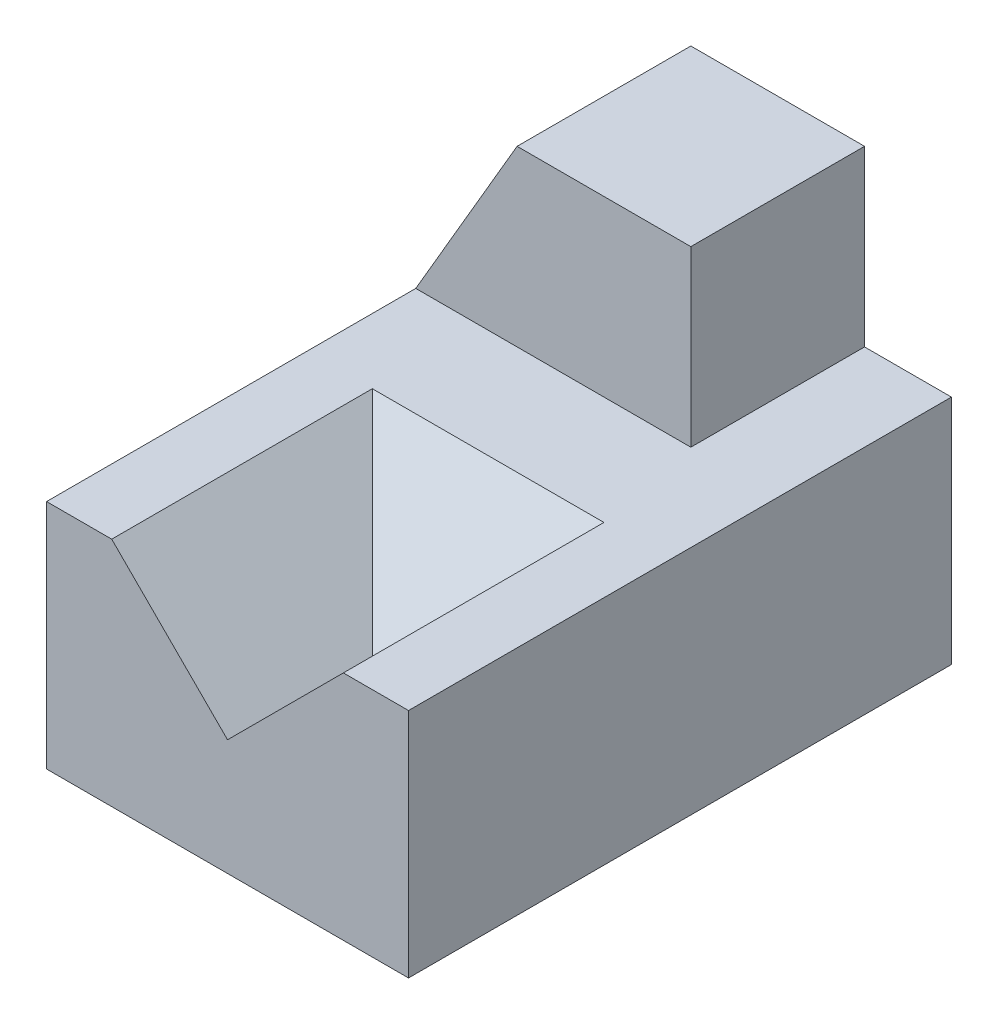
ISO-10303-21;
HEADER;
FILE_DESCRIPTION(('STEP AP214'),'2;1');
FILE_NAME('part.step','',(''),(''),'','','');
FILE_SCHEMA(('AUTOMOTIVE_DESIGN { 1 0 10303 214 1 1 1 1 }'));
ENDSEC;
DATA;
#1=APPLICATION_CONTEXT('core data for automotive mechanical design processes');
#2=APPLICATION_PROTOCOL_DEFINITION('international standard','automotive_design',2000,#1);
#3=PRODUCT_CONTEXT('',#1,'mechanical');
#4=PRODUCT('Part','Part','',(#3));
#5=PRODUCT_RELATED_PRODUCT_CATEGORY('part','',(#4));
#6=PRODUCT_DEFINITION_FORMATION('','',#4);
#7=PRODUCT_DEFINITION_CONTEXT('part definition',#1,'design');
#8=PRODUCT_DEFINITION('design','',#6,#7);
#9=PRODUCT_DEFINITION_SHAPE('','',#8);
#10=(LENGTH_UNIT() NAMED_UNIT(*) SI_UNIT(.MILLI.,.METRE.));
#11=(NAMED_UNIT(*) PLANE_ANGLE_UNIT() SI_UNIT($,.RADIAN.));
#12=(NAMED_UNIT(*) SI_UNIT($,.STERADIAN.) SOLID_ANGLE_UNIT());
#13=UNCERTAINTY_MEASURE_WITH_UNIT(LENGTH_MEASURE(1.E-05),#10,'distance_accuracy_value','');
#14=(GEOMETRIC_REPRESENTATION_CONTEXT(3) GLOBAL_UNCERTAINTY_ASSIGNED_CONTEXT((#13)) GLOBAL_UNIT_ASSIGNED_CONTEXT((#10,
#11,#12)) REPRESENTATION_CONTEXT('',''));
#15=CARTESIAN_POINT('',(0.,0.,0.));
#16=DIRECTION('',(0.,0.,1.));
#17=DIRECTION('',(1.,0.,0.));
#18=AXIS2_PLACEMENT_3D('',#15,#16,#17);
#19=CARTESIAN_POINT('',(0.,32.,0.));
#20=DIRECTION('',(-1.,0.,0.));
#21=DIRECTION('',(0.,0.,1.));
#22=AXIS2_PLACEMENT_3D('',#19,#20,#21);
#23=PLANE('',#22);
#24=DIRECTION('',(0.,0.,-1.));
#25=VECTOR('',#24,1.);
#26=CARTESIAN_POINT('',(0.,0.,0.));
#27=LINE('',#26,#25);
#28=CARTESIAN_POINT('',(0.,0.,0.));
#29=VERTEX_POINT('',#28);
#30=CARTESIAN_POINT('',(0.,0.,-75.));
#31=VERTEX_POINT('',#30);
#32=EDGE_CURVE('E161',#29,#31,#27,.T.);
#33=ORIENTED_EDGE('',*,*,#32,.T.);
#34=DIRECTION('',(0.,-1.,0.));
#35=VECTOR('',#34,1.);
#36=CARTESIAN_POINT('',(0.,32.,-75.));
#37=LINE('',#36,#35);
#38=CARTESIAN_POINT('',(0.,32.,-75.));
#39=VERTEX_POINT('',#38);
#40=EDGE_CURVE('E11',#39,#31,#37,.T.);
#41=ORIENTED_EDGE('',*,*,#40,.F.);
#42=DIRECTION('',(0.,0.,-1.));
#43=VECTOR('',#42,1.);
#44=CARTESIAN_POINT('',(0.,32.,0.));
#45=LINE('',#44,#43);
#46=CARTESIAN_POINT('',(0.,32.,0.));
#47=VERTEX_POINT('',#46);
#48=EDGE_CURVE('E148',#47,#39,#45,.T.);
#49=ORIENTED_EDGE('',*,*,#48,.F.);
#50=DIRECTION('',(0.,-1.,0.));
#51=VECTOR('',#50,1.);
#52=CARTESIAN_POINT('',(0.,32.,0.));
#53=LINE('',#52,#51);
#54=EDGE_CURVE('E160',#47,#29,#53,.T.);
#55=ORIENTED_EDGE('',*,*,#54,.T.);
#56=EDGE_LOOP('',(#33,#41,#49,#55));
#57=FACE_BOUND('',#56,.T.);
#58=ADVANCED_FACE('F40',(#57),#23,.F.);
#59=CARTESIAN_POINT('',(0.,32.,-75.));
#60=DIRECTION('',(0.,0.,1.));
#61=DIRECTION('',(1.,0.,0.));
#62=AXIS2_PLACEMENT_3D('',#59,#60,#61);
#63=PLANE('',#62);
#64=DIRECTION('',(-1.,0.,0.));
#65=VECTOR('',#64,1.);
#66=CARTESIAN_POINT('',(0.,0.,-75.));
#67=LINE('',#66,#65);
#68=CARTESIAN_POINT('',(-50.,0.,-75.));
#69=VERTEX_POINT('',#68);
#70=EDGE_CURVE('E164',#31,#69,#67,.T.);
#71=ORIENTED_EDGE('',*,*,#70,.T.);
#72=DIRECTION('',(0.,-1.,0.));
#73=VECTOR('',#72,1.);
#74=CARTESIAN_POINT('',(-50.,32.,-75.));
#75=LINE('',#74,#73);
#76=CARTESIAN_POINT('',(-50.,32.,-75.));
#77=VERTEX_POINT('',#76);
#78=EDGE_CURVE('E47',#77,#69,#75,.T.);
#79=ORIENTED_EDGE('',*,*,#78,.F.);
#80=DIRECTION('',(-0.503871025524086,-0.863778900898434,0.));
#81=VECTOR('',#80,1.);
#82=CARTESIAN_POINT('',(-36.,56.,-75.));
#83=LINE('',#82,#81);
#84=CARTESIAN_POINT('',(-36.,56.,-75.));
#85=VERTEX_POINT('',#84);
#86=EDGE_CURVE('E137',#85,#77,#83,.T.);
#87=ORIENTED_EDGE('',*,*,#86,.F.);
#88=DIRECTION('',(-1.,0.,0.));
#89=VECTOR('',#88,1.);
#90=CARTESIAN_POINT('',(-12.,56.,-75.));
#91=LINE('',#90,#89);
#92=CARTESIAN_POINT('',(-12.,56.,-75.));
#93=VERTEX_POINT('',#92);
#94=EDGE_CURVE('E143',#93,#85,#91,.T.);
#95=ORIENTED_EDGE('',*,*,#94,.F.);
#96=DIRECTION('',(0.,1.,0.));
#97=VECTOR('',#96,1.);
#98=CARTESIAN_POINT('',(-12.,32.,-75.));
#99=LINE('',#98,#97);
#100=CARTESIAN_POINT('',(-12.,32.,-75.));
#101=VERTEX_POINT('',#100);
#102=EDGE_CURVE('E134',#101,#93,#99,.T.);
#103=ORIENTED_EDGE('',*,*,#102,.F.);
#104=DIRECTION('',(-1.,0.,0.));
#105=VECTOR('',#104,1.);
#106=CARTESIAN_POINT('',(0.,32.,-75.));
#107=LINE('',#106,#105);
#108=EDGE_CURVE('E90',#39,#101,#107,.T.);
#109=ORIENTED_EDGE('',*,*,#108,.F.);
#110=ORIENTED_EDGE('',*,*,#40,.T.);
#111=EDGE_LOOP('',(#71,#79,#87,#95,#103,#109,#110));
#112=FACE_BOUND('',#111,.T.);
#113=ADVANCED_FACE('F140',(#112),#63,.F.);
#114=CARTESIAN_POINT('',(-50.,32.,0.));
#115=DIRECTION('',(1.,0.,0.));
#116=DIRECTION('',(0.,0.,-1.));
#117=AXIS2_PLACEMENT_3D('',#114,#115,#116);
#118=PLANE('',#117);
#119=DIRECTION('',(0.,0.,1.));
#120=VECTOR('',#119,1.);
#121=CARTESIAN_POINT('',(-50.,0.,0.));
#122=LINE('',#121,#120);
#123=CARTESIAN_POINT('',(-50.,0.,0.));
#124=VERTEX_POINT('',#123);
#125=EDGE_CURVE('E167',#69,#124,#122,.T.);
#126=ORIENTED_EDGE('',*,*,#125,.T.);
#127=DIRECTION('',(0.,-1.,0.));
#128=VECTOR('',#127,1.);
#129=CARTESIAN_POINT('',(-50.,32.,0.));
#130=LINE('',#129,#128);
#131=CARTESIAN_POINT('',(-50.,32.,0.));
#132=VERTEX_POINT('',#131);
#133=EDGE_CURVE('E171',#132,#124,#130,.T.);
#134=ORIENTED_EDGE('',*,*,#133,.F.);
#135=DIRECTION('',(0.,0.,1.));
#136=VECTOR('',#135,1.);
#137=CARTESIAN_POINT('',(-50.,32.,0.));
#138=LINE('',#137,#136);
#139=CARTESIAN_POINT('',(-50.,32.,-51.));
#140=VERTEX_POINT('',#139);
#141=EDGE_CURVE('E150',#140,#132,#138,.T.);
#142=ORIENTED_EDGE('',*,*,#141,.F.);
#143=EDGE_CURVE('E152',#77,#140,#138,.T.);
#144=ORIENTED_EDGE('',*,*,#143,.F.);
#145=ORIENTED_EDGE('',*,*,#78,.T.);
#146=EDGE_LOOP('',(#126,#134,#142,#144,#145));
#147=FACE_BOUND('',#146,.T.);
#148=ADVANCED_FACE('F177',(#147),#118,.F.);
#149=CARTESIAN_POINT('',(0.,32.,0.));
#150=DIRECTION('',(0.,0.,-1.));
#151=DIRECTION('',(-1.,0.,0.));
#152=AXIS2_PLACEMENT_3D('',#149,#150,#151);
#153=PLANE('',#152);
#154=DIRECTION('',(1.,0.,0.));
#155=VECTOR('',#154,1.);
#156=CARTESIAN_POINT('',(0.,32.,0.));
#157=LINE('',#156,#155);
#158=CARTESIAN_POINT('',(-8.99999999999999,32.,0.));
#159=VERTEX_POINT('',#158);
#160=EDGE_CURVE('E63',#159,#47,#157,.T.);
#161=ORIENTED_EDGE('',*,*,#160,.F.);
#162=DIRECTION('',(0.707106781186548,0.707106781186547,0.));
#163=VECTOR('',#162,1.);
#164=CARTESIAN_POINT('',(-8.99999999999999,32.,0.));
#165=LINE('',#164,#163);
#166=CARTESIAN_POINT('',(-25.,16.,0.));
#167=VERTEX_POINT('',#166);
#168=EDGE_CURVE('E187',#167,#159,#165,.T.);
#169=ORIENTED_EDGE('',*,*,#168,.F.);
#170=DIRECTION('',(0.707106781186548,-0.707106781186547,0.));
#171=VECTOR('',#170,1.);
#172=CARTESIAN_POINT('',(-25.,16.,0.));
#173=LINE('',#172,#171);
#174=CARTESIAN_POINT('',(-41.,32.,0.));
#175=VERTEX_POINT('',#174);
#176=EDGE_CURVE('E190',#175,#167,#173,.T.);
#177=ORIENTED_EDGE('',*,*,#176,.F.);
#178=EDGE_CURVE('E157',#132,#175,#157,.T.);
#179=ORIENTED_EDGE('',*,*,#178,.F.);
#180=ORIENTED_EDGE('',*,*,#133,.T.);
#181=DIRECTION('',(1.,0.,0.));
#182=VECTOR('',#181,1.);
#183=CARTESIAN_POINT('',(0.,0.,0.));
#184=LINE('',#183,#182);
#185=EDGE_CURVE('E84',#124,#29,#184,.T.);
#186=ORIENTED_EDGE('',*,*,#185,.T.);
#187=ORIENTED_EDGE('',*,*,#54,.F.);
#188=EDGE_LOOP('',(#161,#169,#177,#179,#180,#186,#187));
#189=FACE_BOUND('',#188,.T.);
#190=ADVANCED_FACE('F184',(#189),#153,.F.);
#191=CARTESIAN_POINT('',(0.,32.,0.));
#192=DIRECTION('',(0.,1.,0.));
#193=DIRECTION('',(0.,0.,1.));
#194=AXIS2_PLACEMENT_3D('',#191,#192,#193);
#195=PLANE('',#194);
#196=DIRECTION('',(1.,0.,0.));
#197=VECTOR('',#196,1.);
#198=CARTESIAN_POINT('',(-50.,32.,-51.));
#199=LINE('',#198,#197);
#200=CARTESIAN_POINT('',(-12.,32.,-51.));
#201=VERTEX_POINT('',#200);
#202=EDGE_CURVE('E54',#140,#201,#199,.T.);
#203=ORIENTED_EDGE('',*,*,#202,.F.);
#204=ORIENTED_EDGE('',*,*,#141,.T.);
#205=ORIENTED_EDGE('',*,*,#178,.T.);
#206=DIRECTION('',(0.,0.,1.));
#207=VECTOR('',#206,1.);
#208=CARTESIAN_POINT('',(-41.,32.,-36.));
#209=LINE('',#208,#207);
#210=CARTESIAN_POINT('',(-41.,32.,-36.));
#211=VERTEX_POINT('',#210);
#212=EDGE_CURVE('E192',#211,#175,#209,.T.);
#213=ORIENTED_EDGE('',*,*,#212,.F.);
#214=DIRECTION('',(-1.,0.,0.));
#215=VECTOR('',#214,1.);
#216=CARTESIAN_POINT('',(-41.,32.,-36.));
#217=LINE('',#216,#215);
#218=CARTESIAN_POINT('',(-9.,32.,-36.));
#219=VERTEX_POINT('',#218);
#220=EDGE_CURVE('E200',#219,#211,#217,.T.);
#221=ORIENTED_EDGE('',*,*,#220,.F.);
#222=DIRECTION('',(0.,0.,-1.));
#223=VECTOR('',#222,1.);
#224=CARTESIAN_POINT('',(-9.,32.,-36.));
#225=LINE('',#224,#223);
#226=EDGE_CURVE('E194',#159,#219,#225,.T.);
#227=ORIENTED_EDGE('',*,*,#226,.F.);
#228=ORIENTED_EDGE('',*,*,#160,.T.);
#229=ORIENTED_EDGE('',*,*,#48,.T.);
#230=ORIENTED_EDGE('',*,*,#108,.T.);
#231=DIRECTION('',(0.,0.,1.));
#232=VECTOR('',#231,1.);
#233=CARTESIAN_POINT('',(-12.,32.,-75.));
#234=LINE('',#233,#232);
#235=EDGE_CURVE('E132',#101,#201,#234,.T.);
#236=ORIENTED_EDGE('',*,*,#235,.T.);
#237=EDGE_LOOP('',(#203,#204,#205,#213,#221,#227,#228,#229,#230,#236));
#238=FACE_BOUND('',#237,.T.);
#239=ADVANCED_FACE('F146',(#238),#195,.T.);
#240=CARTESIAN_POINT('',(0.,0.,0.));
#241=DIRECTION('',(0.,1.,0.));
#242=DIRECTION('',(0.,0.,1.));
#243=AXIS2_PLACEMENT_3D('',#240,#241,#242);
#244=PLANE('',#243);
#245=ORIENTED_EDGE('',*,*,#32,.F.);
#246=ORIENTED_EDGE('',*,*,#185,.F.);
#247=ORIENTED_EDGE('',*,*,#125,.F.);
#248=ORIENTED_EDGE('',*,*,#70,.F.);
#249=EDGE_LOOP('',(#245,#246,#247,#248));
#250=FACE_BOUND('',#249,.T.);
#251=ADVANCED_FACE('F182',(#250),#244,.F.);
#252=CARTESIAN_POINT('',(-41.,32.,-36.));
#253=DIRECTION('',(-0.707106781186547,-0.707106781186548,0.));
#254=DIRECTION('',(0.707106781186548,-0.707106781186547,0.));
#255=AXIS2_PLACEMENT_3D('',#252,#253,#254);
#256=PLANE('',#255);
#257=ORIENTED_EDGE('',*,*,#212,.T.);
#258=ORIENTED_EDGE('',*,*,#176,.T.);
#259=DIRECTION('',(0.,0.,-1.));
#260=VECTOR('',#259,1.);
#261=CARTESIAN_POINT('',(-25.,16.,0.));
#262=LINE('',#261,#260);
#263=CARTESIAN_POINT('',(-25.,16.,-20.));
#264=VERTEX_POINT('',#263);
#265=EDGE_CURVE('E203',#167,#264,#262,.T.);
#266=ORIENTED_EDGE('',*,*,#265,.T.);
#267=DIRECTION('',(-0.577350269189626,0.577350269189625,-0.577350269189626));
#268=VECTOR('',#267,1.);
#269=CARTESIAN_POINT('',(-41.,32.,-36.));
#270=LINE('',#269,#268);
#271=EDGE_CURVE('E165',#264,#211,#270,.T.);
#272=ORIENTED_EDGE('',*,*,#271,.T.);
#273=EDGE_LOOP('',(#257,#258,#266,#272));
#274=FACE_BOUND('',#273,.T.);
#275=ADVANCED_FACE('F209',(#274),#256,.F.);
#276=CARTESIAN_POINT('',(-41.,32.,-36.));
#277=DIRECTION('',(0.,-0.707106781186548,-0.707106781186547));
#278=DIRECTION('',(0.,0.707106781186547,-0.707106781186548));
#279=AXIS2_PLACEMENT_3D('',#276,#277,#278);
#280=PLANE('',#279);
#281=ORIENTED_EDGE('',*,*,#220,.T.);
#282=ORIENTED_EDGE('',*,*,#271,.F.);
#283=DIRECTION('',(0.577350269189626,0.577350269189625,-0.577350269189626));
#284=VECTOR('',#283,1.);
#285=CARTESIAN_POINT('',(-9.,32.,-36.));
#286=LINE('',#285,#284);
#287=EDGE_CURVE('E205',#264,#219,#286,.T.);
#288=ORIENTED_EDGE('',*,*,#287,.T.);
#289=EDGE_LOOP('',(#281,#282,#288));
#290=FACE_BOUND('',#289,.T.);
#291=ADVANCED_FACE('F214',(#290),#280,.F.);
#292=CARTESIAN_POINT('',(-9.,32.,-36.));
#293=DIRECTION('',(0.707106781186547,-0.707106781186548,0.));
#294=DIRECTION('',(0.707106781186548,0.707106781186547,0.));
#295=AXIS2_PLACEMENT_3D('',#292,#293,#294);
#296=PLANE('',#295);
#297=ORIENTED_EDGE('',*,*,#265,.F.);
#298=ORIENTED_EDGE('',*,*,#168,.T.);
#299=ORIENTED_EDGE('',*,*,#226,.T.);
#300=ORIENTED_EDGE('',*,*,#287,.F.);
#301=EDGE_LOOP('',(#297,#298,#299,#300));
#302=FACE_BOUND('',#301,.T.);
#303=ADVANCED_FACE('F211',(#302),#296,.F.);
#304=CARTESIAN_POINT('',(-36.,56.,-75.));
#305=DIRECTION('',(-0.863778900898433,0.503871025524086,0.));
#306=DIRECTION('',(-0.503871025524086,-0.863778900898434,0.));
#307=AXIS2_PLACEMENT_3D('',#304,#305,#306);
#308=PLANE('',#307);
#309=DIRECTION('',(-0.503871025524086,-0.863778900898434,0.));
#310=VECTOR('',#309,1.);
#311=CARTESIAN_POINT('',(-36.,56.,-51.));
#312=LINE('',#311,#310);
#313=CARTESIAN_POINT('',(-36.,56.,-51.));
#314=VERTEX_POINT('',#313);
#315=EDGE_CURVE('E144',#314,#140,#312,.T.);
#316=ORIENTED_EDGE('',*,*,#315,.F.);
#317=DIRECTION('',(0.,0.,1.));
#318=VECTOR('',#317,1.);
#319=CARTESIAN_POINT('',(-36.,56.,-75.));
#320=LINE('',#319,#318);
#321=EDGE_CURVE('E196',#85,#314,#320,.T.);
#322=ORIENTED_EDGE('',*,*,#321,.F.);
#323=ORIENTED_EDGE('',*,*,#86,.T.);
#324=ORIENTED_EDGE('',*,*,#143,.T.);
#325=EDGE_LOOP('',(#316,#322,#323,#324));
#326=FACE_BOUND('',#325,.T.);
#327=ADVANCED_FACE('F257',(#326),#308,.T.);
#328=CARTESIAN_POINT('',(-12.,56.,-75.));
#329=DIRECTION('',(0.,1.,0.));
#330=DIRECTION('',(-1.,0.,0.));
#331=AXIS2_PLACEMENT_3D('',#328,#329,#330);
#332=PLANE('',#331);
#333=DIRECTION('',(-1.,0.,0.));
#334=VECTOR('',#333,1.);
#335=CARTESIAN_POINT('',(-12.,56.,-51.));
#336=LINE('',#335,#334);
#337=CARTESIAN_POINT('',(-12.,56.,-51.));
#338=VERTEX_POINT('',#337);
#339=EDGE_CURVE('E217',#338,#314,#336,.T.);
#340=ORIENTED_EDGE('',*,*,#339,.F.);
#341=DIRECTION('',(0.,0.,1.));
#342=VECTOR('',#341,1.);
#343=CARTESIAN_POINT('',(-12.,56.,-75.));
#344=LINE('',#343,#342);
#345=EDGE_CURVE('E136',#93,#338,#344,.T.);
#346=ORIENTED_EDGE('',*,*,#345,.F.);
#347=ORIENTED_EDGE('',*,*,#94,.T.);
#348=ORIENTED_EDGE('',*,*,#321,.T.);
#349=EDGE_LOOP('',(#340,#346,#347,#348));
#350=FACE_BOUND('',#349,.T.);
#351=ADVANCED_FACE('F228',(#350),#332,.T.);
#352=CARTESIAN_POINT('',(-12.,32.,-75.));
#353=DIRECTION('',(1.,0.,0.));
#354=DIRECTION('',(0.,1.,0.));
#355=AXIS2_PLACEMENT_3D('',#352,#353,#354);
#356=PLANE('',#355);
#357=DIRECTION('',(0.,1.,0.));
#358=VECTOR('',#357,1.);
#359=CARTESIAN_POINT('',(-12.,32.,-51.));
#360=LINE('',#359,#358);
#361=EDGE_CURVE('E135',#201,#338,#360,.T.);
#362=ORIENTED_EDGE('',*,*,#361,.F.);
#363=ORIENTED_EDGE('',*,*,#235,.F.);
#364=ORIENTED_EDGE('',*,*,#102,.T.);
#365=ORIENTED_EDGE('',*,*,#345,.T.);
#366=EDGE_LOOP('',(#362,#363,#364,#365));
#367=FACE_BOUND('',#366,.T.);
#368=ADVANCED_FACE('F133',(#367),#356,.T.);
#369=CARTESIAN_POINT('',(0.,0.,-51.));
#370=DIRECTION('',(0.,0.,1.));
#371=DIRECTION('',(1.,0.,0.));
#372=AXIS2_PLACEMENT_3D('',#369,#370,#371);
#373=PLANE('',#372);
#374=ORIENTED_EDGE('',*,*,#202,.T.);
#375=ORIENTED_EDGE('',*,*,#361,.T.);
#376=ORIENTED_EDGE('',*,*,#339,.T.);
#377=ORIENTED_EDGE('',*,*,#315,.T.);
#378=EDGE_LOOP('',(#374,#375,#376,#377));
#379=FACE_BOUND('',#378,.T.);
#380=ADVANCED_FACE('F230',(#379),#373,.T.);
#381=CLOSED_SHELL('',(#58,#113,#148,#190,#239,#251,#275,#291,#303,#327,#351,#368,#380));
#382=MANIFOLD_SOLID_BREP('B2',#381);
#383=ADVANCED_BREP_SHAPE_REPRESENTATION('',(#18,#382),#14);
#384=SHAPE_DEFINITION_REPRESENTATION(#9,#383);
ENDSEC;
END-ISO-10303-21;
